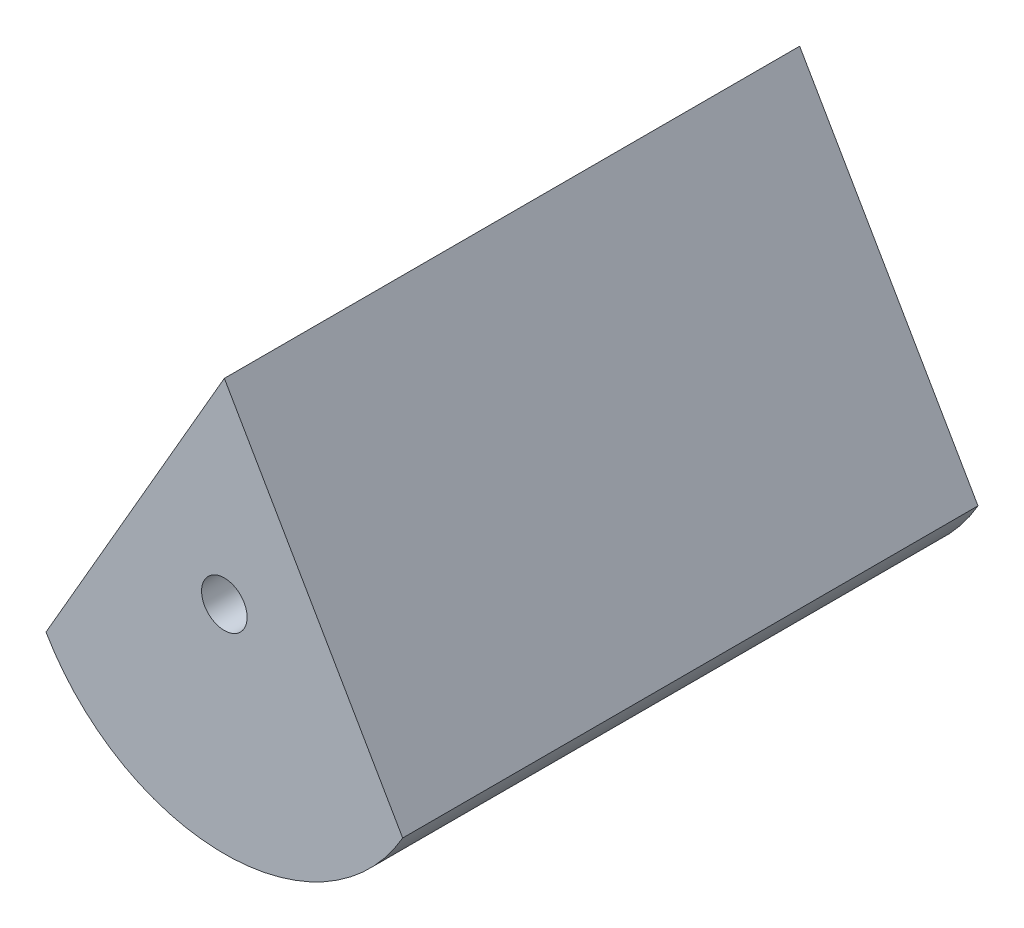
ISO-10303-21;
HEADER;
FILE_DESCRIPTION(('STEP AP214'),'2;1');
FILE_NAME('part.step','',(''),(''),'','','');
FILE_SCHEMA(('AUTOMOTIVE_DESIGN { 1 0 10303 214 1 1 1 1 }'));
ENDSEC;
DATA;
#1=APPLICATION_CONTEXT('core data for automotive mechanical design processes');
#2=APPLICATION_PROTOCOL_DEFINITION('international standard','automotive_design',2000,#1);
#3=PRODUCT_CONTEXT('',#1,'mechanical');
#4=PRODUCT('Part','Part','',(#3));
#5=PRODUCT_RELATED_PRODUCT_CATEGORY('part','',(#4));
#6=PRODUCT_DEFINITION_FORMATION('','',#4);
#7=PRODUCT_DEFINITION_CONTEXT('part definition',#1,'design');
#8=PRODUCT_DEFINITION('design','',#6,#7);
#9=PRODUCT_DEFINITION_SHAPE('','',#8);
#10=(LENGTH_UNIT() NAMED_UNIT(*) SI_UNIT(.MILLI.,.METRE.));
#11=(NAMED_UNIT(*) PLANE_ANGLE_UNIT() SI_UNIT($,.RADIAN.));
#12=(NAMED_UNIT(*) SI_UNIT($,.STERADIAN.) SOLID_ANGLE_UNIT());
#13=UNCERTAINTY_MEASURE_WITH_UNIT(LENGTH_MEASURE(1.E-05),#10,'distance_accuracy_value','');
#14=(GEOMETRIC_REPRESENTATION_CONTEXT(3) GLOBAL_UNCERTAINTY_ASSIGNED_CONTEXT((#13)) GLOBAL_UNIT_ASSIGNED_CONTEXT((#10,
#11,#12)) REPRESENTATION_CONTEXT('',''));
#15=CARTESIAN_POINT('',(0.,0.,0.));
#16=DIRECTION('',(0.,0.,1.));
#17=DIRECTION('',(1.,0.,0.));
#18=AXIS2_PLACEMENT_3D('',#15,#16,#17);
#19=CARTESIAN_POINT('',(15.5000000000001,-8.94892917243904,50.));
#20=DIRECTION('',(-0.866025403784436,-0.500000000000004,0.));
#21=DIRECTION('',(0.500000000000004,-0.866025403784436,0.));
#22=AXIS2_PLACEMENT_3D('',#19,#20,#21);
#23=PLANE('',#22);
#24=DIRECTION('',(-0.500000000000004,0.866025403784436,0.));
#25=VECTOR('',#24,1.);
#26=CARTESIAN_POINT('',(15.5000000000001,-8.94892917243904,0.));
#27=LINE('',#26,#25);
#28=CARTESIAN_POINT('',(15.5000000000001,-8.94892917243905,0.));
#29=VERTEX_POINT('',#28);
#30=CARTESIAN_POINT('',(0.,17.8978583448784,0.));
#31=VERTEX_POINT('',#30);
#32=EDGE_CURVE('E80',#29,#31,#27,.T.);
#33=ORIENTED_EDGE('',*,*,#32,.T.);
#34=DIRECTION('',(0.,0.,-1.));
#35=VECTOR('',#34,1.);
#36=CARTESIAN_POINT('',(0.,17.8978583448784,50.));
#37=LINE('',#36,#35);
#38=CARTESIAN_POINT('',(0.,17.8978583448784,50.));
#39=VERTEX_POINT('',#38);
#40=EDGE_CURVE('E11',#39,#31,#37,.T.);
#41=ORIENTED_EDGE('',*,*,#40,.F.);
#42=DIRECTION('',(-0.500000000000004,0.866025403784436,0.));
#43=VECTOR('',#42,1.);
#44=CARTESIAN_POINT('',(15.5000000000001,-8.94892917243904,50.));
#45=LINE('',#44,#43);
#46=CARTESIAN_POINT('',(15.5000000000001,-8.94892917243905,50.));
#47=VERTEX_POINT('',#46);
#48=EDGE_CURVE('E73',#47,#39,#45,.T.);
#49=ORIENTED_EDGE('',*,*,#48,.F.);
#50=DIRECTION('',(0.,0.,-1.));
#51=VECTOR('',#50,1.);
#52=CARTESIAN_POINT('',(15.5000000000001,-8.94892917243905,50.));
#53=LINE('',#52,#51);
#54=EDGE_CURVE('E81',#47,#29,#53,.T.);
#55=ORIENTED_EDGE('',*,*,#54,.T.);
#56=EDGE_LOOP('',(#33,#41,#49,#55));
#57=FACE_BOUND('',#56,.T.);
#58=ADVANCED_FACE('F33',(#57),#23,.F.);
#59=CARTESIAN_POINT('',(0.,17.8978583448784,50.));
#60=DIRECTION('',(0.86602540378444,-0.499999999999998,0.));
#61=DIRECTION('',(0.499999999999998,0.86602540378444,0.));
#62=AXIS2_PLACEMENT_3D('',#59,#60,#61);
#63=PLANE('',#62);
#64=DIRECTION('',(-0.499999999999998,-0.86602540378444,0.));
#65=VECTOR('',#64,1.);
#66=CARTESIAN_POINT('',(0.,17.8978583448784,0.));
#67=LINE('',#66,#65);
#68=CARTESIAN_POINT('',(-15.4999999999999,-8.94892917243926,0.));
#69=VERTEX_POINT('',#68);
#70=EDGE_CURVE('E61',#31,#69,#67,.T.);
#71=ORIENTED_EDGE('',*,*,#70,.T.);
#72=DIRECTION('',(0.,0.,-1.));
#73=VECTOR('',#72,1.);
#74=CARTESIAN_POINT('',(-15.4999999999999,-8.94892917243926,50.));
#75=LINE('',#74,#73);
#76=CARTESIAN_POINT('',(-15.4999999999999,-8.94892917243926,50.));
#77=VERTEX_POINT('',#76);
#78=EDGE_CURVE('E41',#77,#69,#75,.T.);
#79=ORIENTED_EDGE('',*,*,#78,.F.);
#80=DIRECTION('',(-0.499999999999998,-0.86602540378444,0.));
#81=VECTOR('',#80,1.);
#82=CARTESIAN_POINT('',(0.,17.8978583448784,50.));
#83=LINE('',#82,#81);
#84=EDGE_CURVE('E69',#39,#77,#83,.T.);
#85=ORIENTED_EDGE('',*,*,#84,.F.);
#86=ORIENTED_EDGE('',*,*,#40,.T.);
#87=EDGE_LOOP('',(#71,#79,#85,#86));
#88=FACE_BOUND('',#87,.T.);
#89=ADVANCED_FACE('F70',(#88),#63,.F.);
#90=CARTESIAN_POINT('',(0.,0.,50.));
#91=DIRECTION('',(0.,0.,-1.));
#92=DIRECTION('',(-1.,0.,0.));
#93=AXIS2_PLACEMENT_3D('',#90,#91,#92);
#94=CYLINDRICAL_SURFACE('',#93,17.8978583448784);
#95=CARTESIAN_POINT('',(0.,0.,0.));
#96=DIRECTION('',(0.,0.,1.));
#97=DIRECTION('',(1.,0.,0.));
#98=AXIS2_PLACEMENT_3D('',#95,#96,#97);
#99=CIRCLE('',#98,17.8978583448784);
#100=EDGE_CURVE('E66',#69,#29,#99,.T.);
#101=ORIENTED_EDGE('',*,*,#100,.T.);
#102=ORIENTED_EDGE('',*,*,#54,.F.);
#103=CARTESIAN_POINT('',(0.,0.,50.));
#104=DIRECTION('',(0.,0.,1.));
#105=DIRECTION('',(1.,0.,0.));
#106=AXIS2_PLACEMENT_3D('',#103,#104,#105);
#107=CIRCLE('',#106,17.8978583448784);
#108=EDGE_CURVE('E49',#77,#47,#107,.T.);
#109=ORIENTED_EDGE('',*,*,#108,.F.);
#110=ORIENTED_EDGE('',*,*,#78,.T.);
#111=EDGE_LOOP('',(#101,#102,#109,#110));
#112=FACE_BOUND('',#111,.T.);
#113=ADVANCED_FACE('F92',(#112),#94,.T.);
#114=CARTESIAN_POINT('',(0.,0.,50.));
#115=DIRECTION('',(0.,0.,1.));
#116=DIRECTION('',(1.,0.,0.));
#117=AXIS2_PLACEMENT_3D('',#114,#115,#116);
#118=PLANE('',#117);
#119=CARTESIAN_POINT('',(0.,0.897858344878373,50.));
#120=DIRECTION('',(0.,0.,1.));
#121=DIRECTION('',(1.,0.,0.));
#122=AXIS2_PLACEMENT_3D('',#119,#120,#121);
#123=CIRCLE('',#122,1.97989898732233);
#124=CARTESIAN_POINT('',(1.97989898732233,0.897858344878373,50.));
#125=VERTEX_POINT('',#124);
#126=EDGE_CURVE('E87',#125,#125,#123,.T.);
#127=ORIENTED_EDGE('',*,*,#126,.F.);
#128=EDGE_LOOP('',(#127));
#129=FACE_BOUND('',#128,.T.);
#130=ORIENTED_EDGE('',*,*,#48,.T.);
#131=ORIENTED_EDGE('',*,*,#84,.T.);
#132=ORIENTED_EDGE('',*,*,#108,.T.);
#133=EDGE_LOOP('',(#130,#131,#132));
#134=FACE_BOUND('',#133,.T.);
#135=ADVANCED_FACE('F76',(#129,#134),#118,.T.);
#136=CARTESIAN_POINT('',(0.,0.,0.));
#137=DIRECTION('',(0.,0.,1.));
#138=DIRECTION('',(1.,0.,0.));
#139=AXIS2_PLACEMENT_3D('',#136,#137,#138);
#140=PLANE('',#139);
#141=CARTESIAN_POINT('',(0.,0.897858344878373,0.));
#142=DIRECTION('',(0.,0.,1.));
#143=DIRECTION('',(1.,0.,0.));
#144=AXIS2_PLACEMENT_3D('',#141,#142,#143);
#145=CIRCLE('',#144,1.97989898732233);
#146=CARTESIAN_POINT('',(1.97989898732233,0.897858344878373,0.));
#147=VERTEX_POINT('',#146);
#148=EDGE_CURVE('E83',#147,#147,#145,.T.);
#149=ORIENTED_EDGE('',*,*,#148,.T.);
#150=EDGE_LOOP('',(#149));
#151=FACE_BOUND('',#150,.T.);
#152=ORIENTED_EDGE('',*,*,#32,.F.);
#153=ORIENTED_EDGE('',*,*,#100,.F.);
#154=ORIENTED_EDGE('',*,*,#70,.F.);
#155=EDGE_LOOP('',(#152,#153,#154));
#156=FACE_BOUND('',#155,.T.);
#157=ADVANCED_FACE('F93',(#151,#156),#140,.F.);
#158=CARTESIAN_POINT('',(0.,0.897858344878373,0.));
#159=DIRECTION('',(0.,0.,1.));
#160=DIRECTION('',(1.,0.,0.));
#161=AXIS2_PLACEMENT_3D('',#158,#159,#160);
#162=CYLINDRICAL_SURFACE('',#161,1.97989898732233);
#163=ORIENTED_EDGE('',*,*,#148,.F.);
#164=EDGE_LOOP('',(#163));
#165=FACE_BOUND('',#164,.T.);
#166=ORIENTED_EDGE('',*,*,#126,.T.);
#167=EDGE_LOOP('',(#166));
#168=FACE_BOUND('',#167,.T.);
#169=ADVANCED_FACE('F95',(#165,#168),#162,.F.);
#170=CLOSED_SHELL('',(#58,#89,#113,#135,#157,#169));
#171=MANIFOLD_SOLID_BREP('B2',#170);
#172=ADVANCED_BREP_SHAPE_REPRESENTATION('',(#18,#171),#14);
#173=SHAPE_DEFINITION_REPRESENTATION(#9,#172);
ENDSEC;
END-ISO-10303-21;
